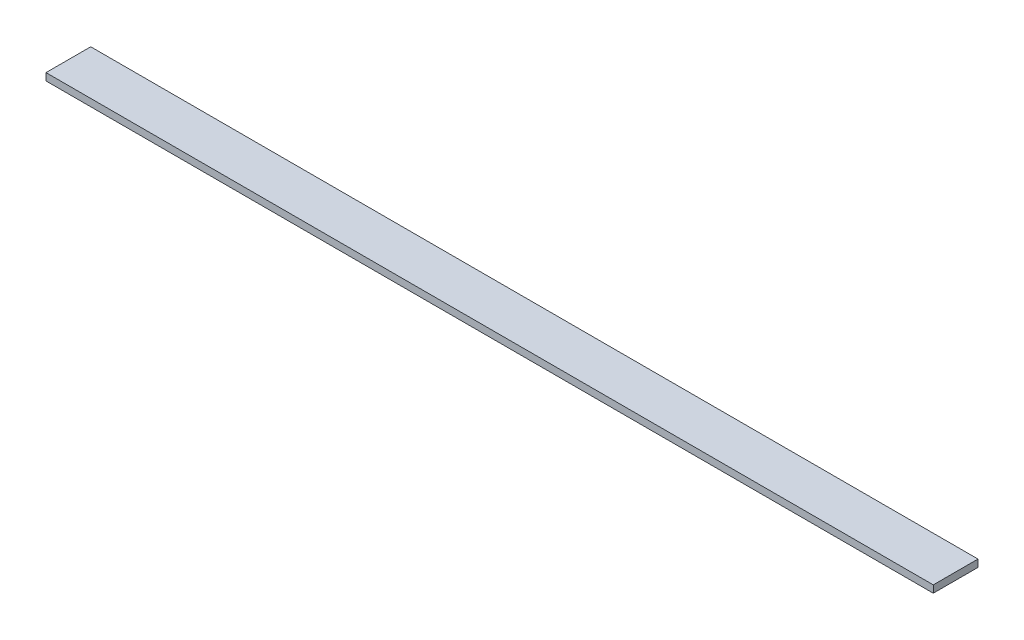
ISO-10303-21;
HEADER;
FILE_DESCRIPTION(('STEP AP214'),'2;1');
FILE_NAME('part.step','',(''),(''),'','','');
FILE_SCHEMA(('AUTOMOTIVE_DESIGN { 1 0 10303 214 1 1 1 1 }'));
ENDSEC;
DATA;
#1=APPLICATION_CONTEXT('core data for automotive mechanical design processes');
#2=APPLICATION_PROTOCOL_DEFINITION('international standard','automotive_design',2000,#1);
#3=PRODUCT_CONTEXT('',#1,'mechanical');
#4=PRODUCT('Part','Part','',(#3));
#5=PRODUCT_RELATED_PRODUCT_CATEGORY('part','',(#4));
#6=PRODUCT_DEFINITION_FORMATION('','',#4);
#7=PRODUCT_DEFINITION_CONTEXT('part definition',#1,'design');
#8=PRODUCT_DEFINITION('design','',#6,#7);
#9=PRODUCT_DEFINITION_SHAPE('','',#8);
#10=(LENGTH_UNIT() NAMED_UNIT(*) SI_UNIT(.MILLI.,.METRE.));
#11=(NAMED_UNIT(*) PLANE_ANGLE_UNIT() SI_UNIT($,.RADIAN.));
#12=(NAMED_UNIT(*) SI_UNIT($,.STERADIAN.) SOLID_ANGLE_UNIT());
#13=UNCERTAINTY_MEASURE_WITH_UNIT(LENGTH_MEASURE(1.E-05),#10,'distance_accuracy_value','');
#14=(GEOMETRIC_REPRESENTATION_CONTEXT(3) GLOBAL_UNCERTAINTY_ASSIGNED_CONTEXT((#13)) GLOBAL_UNIT_ASSIGNED_CONTEXT((#10,
#11,#12)) REPRESENTATION_CONTEXT('',''));
#15=CARTESIAN_POINT('',(0.,0.,0.));
#16=DIRECTION('',(0.,0.,1.));
#17=DIRECTION('',(1.,0.,0.));
#18=AXIS2_PLACEMENT_3D('',#15,#16,#17);
#19=CARTESIAN_POINT('',(-442.728911564626,38.1,-151.039285714286));
#20=DIRECTION('',(1.,0.,0.));
#21=DIRECTION('',(0.,0.,-1.));
#22=AXIS2_PLACEMENT_3D('',#19,#20,#21);
#23=PLANE('',#22);
#24=DIRECTION('',(0.,0.,1.));
#25=VECTOR('',#24,1.);
#26=CARTESIAN_POINT('',(-442.728911564626,0.,-151.039285714286));
#27=LINE('',#26,#25);
#28=CARTESIAN_POINT('',(-442.728911564626,0.,-151.039285714286));
#29=VERTEX_POINT('',#28);
#30=CARTESIAN_POINT('',(-442.728911564626,0.,83.9107142857143));
#31=VERTEX_POINT('',#30);
#32=EDGE_CURVE('E95',#29,#31,#27,.T.);
#33=ORIENTED_EDGE('',*,*,#32,.T.);
#34=DIRECTION('',(0.,-1.,0.));
#35=VECTOR('',#34,1.);
#36=CARTESIAN_POINT('',(-442.728911564626,38.1,83.9107142857143));
#37=LINE('',#36,#35);
#38=CARTESIAN_POINT('',(-442.728911564626,38.1,83.9107142857143));
#39=VERTEX_POINT('',#38);
#40=EDGE_CURVE('E11',#39,#31,#37,.T.);
#41=ORIENTED_EDGE('',*,*,#40,.F.);
#42=DIRECTION('',(0.,0.,1.));
#43=VECTOR('',#42,1.);
#44=CARTESIAN_POINT('',(-442.728911564626,38.1,-151.039285714286));
#45=LINE('',#44,#43);
#46=CARTESIAN_POINT('',(-442.728911564626,38.1,-151.039285714286));
#47=VERTEX_POINT('',#46);
#48=EDGE_CURVE('E81',#47,#39,#45,.T.);
#49=ORIENTED_EDGE('',*,*,#48,.F.);
#50=DIRECTION('',(0.,-1.,0.));
#51=VECTOR('',#50,1.);
#52=CARTESIAN_POINT('',(-442.728911564626,38.1,-151.039285714286));
#53=LINE('',#52,#51);
#54=EDGE_CURVE('E48',#47,#29,#53,.T.);
#55=ORIENTED_EDGE('',*,*,#54,.T.);
#56=EDGE_LOOP('',(#33,#41,#49,#55));
#57=FACE_BOUND('',#56,.T.);
#58=ADVANCED_FACE('F32',(#57),#23,.F.);
#59=CARTESIAN_POINT('',(-442.728911564626,38.1,83.9107142857143));
#60=DIRECTION('',(0.,0.,-1.));
#61=DIRECTION('',(-1.,0.,0.));
#62=AXIS2_PLACEMENT_3D('',#59,#60,#61);
#63=PLANE('',#62);
#64=DIRECTION('',(1.,0.,0.));
#65=VECTOR('',#64,1.);
#66=CARTESIAN_POINT('',(-442.728911564626,0.,83.9107142857143));
#67=LINE('',#66,#65);
#68=CARTESIAN_POINT('',(4218.17108843537,0.,83.9107142857143));
#69=VERTEX_POINT('',#68);
#70=EDGE_CURVE('E86',#31,#69,#67,.T.);
#71=ORIENTED_EDGE('',*,*,#70,.T.);
#72=DIRECTION('',(0.,-1.,0.));
#73=VECTOR('',#72,1.);
#74=CARTESIAN_POINT('',(4218.17108843537,38.1,83.9107142857143));
#75=LINE('',#74,#73);
#76=CARTESIAN_POINT('',(4218.17108843537,38.1,83.9107142857143));
#77=VERTEX_POINT('',#76);
#78=EDGE_CURVE('E40',#77,#69,#75,.T.);
#79=ORIENTED_EDGE('',*,*,#78,.F.);
#80=DIRECTION('',(1.,0.,0.));
#81=VECTOR('',#80,1.);
#82=CARTESIAN_POINT('',(-442.728911564626,38.1,83.9107142857143));
#83=LINE('',#82,#81);
#84=EDGE_CURVE('E73',#39,#77,#83,.T.);
#85=ORIENTED_EDGE('',*,*,#84,.F.);
#86=ORIENTED_EDGE('',*,*,#40,.T.);
#87=EDGE_LOOP('',(#71,#79,#85,#86));
#88=FACE_BOUND('',#87,.T.);
#89=ADVANCED_FACE('F85',(#88),#63,.F.);
#90=CARTESIAN_POINT('',(4218.17108843537,38.1,-151.039285714286));
#91=DIRECTION('',(1.,0.,0.));
#92=DIRECTION('',(0.,0.,-1.));
#93=AXIS2_PLACEMENT_3D('',#90,#91,#92);
#94=PLANE('',#93);
#95=DIRECTION('',(0.,0.,1.));
#96=VECTOR('',#95,1.);
#97=CARTESIAN_POINT('',(4218.17108843537,0.,-151.039285714286));
#98=LINE('',#97,#96);
#99=CARTESIAN_POINT('',(4218.17108843537,0.,-151.039285714286));
#100=VERTEX_POINT('',#99);
#101=EDGE_CURVE('E98',#100,#69,#98,.T.);
#102=ORIENTED_EDGE('',*,*,#101,.F.);
#103=DIRECTION('',(0.,-1.,0.));
#104=VECTOR('',#103,1.);
#105=CARTESIAN_POINT('',(4218.17108843537,38.1,-151.039285714286));
#106=LINE('',#105,#104);
#107=CARTESIAN_POINT('',(4218.17108843537,38.1,-151.039285714286));
#108=VERTEX_POINT('',#107);
#109=EDGE_CURVE('E62',#108,#100,#106,.T.);
#110=ORIENTED_EDGE('',*,*,#109,.F.);
#111=DIRECTION('',(0.,0.,1.));
#112=VECTOR('',#111,1.);
#113=CARTESIAN_POINT('',(4218.17108843537,38.1,-151.039285714286));
#114=LINE('',#113,#112);
#115=EDGE_CURVE('E80',#108,#77,#114,.T.);
#116=ORIENTED_EDGE('',*,*,#115,.T.);
#117=ORIENTED_EDGE('',*,*,#78,.T.);
#118=EDGE_LOOP('',(#102,#110,#116,#117));
#119=FACE_BOUND('',#118,.T.);
#120=ADVANCED_FACE('F89',(#119),#94,.T.);
#121=CARTESIAN_POINT('',(-442.728911564626,38.1,-151.039285714286));
#122=DIRECTION('',(0.,0.,-1.));
#123=DIRECTION('',(-1.,0.,0.));
#124=AXIS2_PLACEMENT_3D('',#121,#122,#123);
#125=PLANE('',#124);
#126=DIRECTION('',(1.,0.,0.));
#127=VECTOR('',#126,1.);
#128=CARTESIAN_POINT('',(-442.728911564626,0.,-151.039285714286));
#129=LINE('',#128,#127);
#130=EDGE_CURVE('E100',#29,#100,#129,.T.);
#131=ORIENTED_EDGE('',*,*,#130,.F.);
#132=ORIENTED_EDGE('',*,*,#54,.F.);
#133=DIRECTION('',(1.,0.,0.));
#134=VECTOR('',#133,1.);
#135=CARTESIAN_POINT('',(-442.728911564626,38.1,-151.039285714286));
#136=LINE('',#135,#134);
#137=EDGE_CURVE('E90',#47,#108,#136,.T.);
#138=ORIENTED_EDGE('',*,*,#137,.T.);
#139=ORIENTED_EDGE('',*,*,#109,.T.);
#140=EDGE_LOOP('',(#131,#132,#138,#139));
#141=FACE_BOUND('',#140,.T.);
#142=ADVANCED_FACE('F106',(#141),#125,.T.);
#143=CARTESIAN_POINT('',(0.,38.1,0.));
#144=DIRECTION('',(0.,1.,0.));
#145=DIRECTION('',(0.,0.,1.));
#146=AXIS2_PLACEMENT_3D('',#143,#144,#145);
#147=PLANE('',#146);
#148=ORIENTED_EDGE('',*,*,#48,.T.);
#149=ORIENTED_EDGE('',*,*,#84,.T.);
#150=ORIENTED_EDGE('',*,*,#115,.F.);
#151=ORIENTED_EDGE('',*,*,#137,.F.);
#152=EDGE_LOOP('',(#148,#149,#150,#151));
#153=FACE_BOUND('',#152,.T.);
#154=ADVANCED_FACE('F77',(#153),#147,.T.);
#155=CARTESIAN_POINT('',(0.,0.,0.));
#156=DIRECTION('',(0.,1.,0.));
#157=DIRECTION('',(0.,0.,1.));
#158=AXIS2_PLACEMENT_3D('',#155,#156,#157);
#159=PLANE('',#158);
#160=ORIENTED_EDGE('',*,*,#32,.F.);
#161=ORIENTED_EDGE('',*,*,#130,.T.);
#162=ORIENTED_EDGE('',*,*,#101,.T.);
#163=ORIENTED_EDGE('',*,*,#70,.F.);
#164=EDGE_LOOP('',(#160,#161,#162,#163));
#165=FACE_BOUND('',#164,.T.);
#166=ADVANCED_FACE('F105',(#165),#159,.F.);
#167=CLOSED_SHELL('',(#58,#89,#120,#142,#154,#166));
#168=MANIFOLD_SOLID_BREP('B2',#167);
#169=ADVANCED_BREP_SHAPE_REPRESENTATION('',(#18,#168),#14);
#170=SHAPE_DEFINITION_REPRESENTATION(#9,#169);
ENDSEC;
END-ISO-10303-21;
